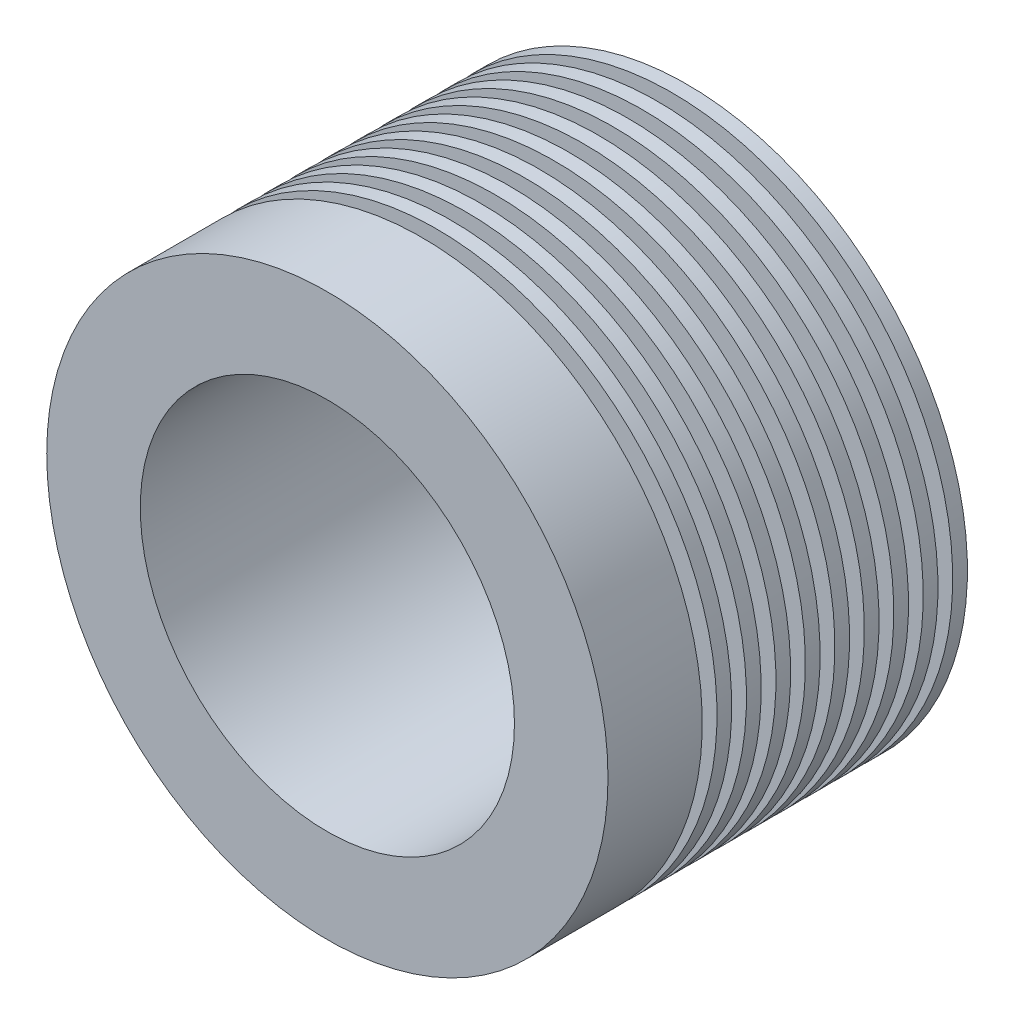
ISO-10303-21;
HEADER;
FILE_DESCRIPTION(('STEP AP214'),'2;1');
FILE_NAME('part.step','',(''),(''),'','','');
FILE_SCHEMA(('AUTOMOTIVE_DESIGN { 1 0 10303 214 1 1 1 1 }'));
ENDSEC;
DATA;
#1=APPLICATION_CONTEXT('core data for automotive mechanical design processes');
#2=APPLICATION_PROTOCOL_DEFINITION('international standard','automotive_design',2000,#1);
#3=PRODUCT_CONTEXT('',#1,'mechanical');
#4=PRODUCT('Part','Part','',(#3));
#5=PRODUCT_RELATED_PRODUCT_CATEGORY('part','',(#4));
#6=PRODUCT_DEFINITION_FORMATION('','',#4);
#7=PRODUCT_DEFINITION_CONTEXT('part definition',#1,'design');
#8=PRODUCT_DEFINITION('design','',#6,#7);
#9=PRODUCT_DEFINITION_SHAPE('','',#8);
#10=(LENGTH_UNIT() NAMED_UNIT(*) SI_UNIT(.MILLI.,.METRE.));
#11=(NAMED_UNIT(*) PLANE_ANGLE_UNIT() SI_UNIT($,.RADIAN.));
#12=(NAMED_UNIT(*) SI_UNIT($,.STERADIAN.) SOLID_ANGLE_UNIT());
#13=UNCERTAINTY_MEASURE_WITH_UNIT(LENGTH_MEASURE(1.E-05),#10,'distance_accuracy_value','');
#14=(GEOMETRIC_REPRESENTATION_CONTEXT(3) GLOBAL_UNCERTAINTY_ASSIGNED_CONTEXT((#13)) GLOBAL_UNIT_ASSIGNED_CONTEXT((#10,
#11,#12)) REPRESENTATION_CONTEXT('',''));
#15=CARTESIAN_POINT('',(0.,0.,0.));
#16=DIRECTION('',(0.,0.,1.));
#17=DIRECTION('',(1.,0.,0.));
#18=AXIS2_PLACEMENT_3D('',#15,#16,#17);
#19=CARTESIAN_POINT('',(0.,0.,50.8));
#20=DIRECTION('',(0.,0.,-1.));
#21=DIRECTION('',(-1.,0.,0.));
#22=AXIS2_PLACEMENT_3D('',#19,#20,#21);
#23=CYLINDRICAL_SURFACE('',#22,38.1);
#24=CARTESIAN_POINT('',(0.,0.,4.));
#25=DIRECTION('',(0.,0.,-1.));
#26=DIRECTION('',(-1.,0.,0.));
#27=AXIS2_PLACEMENT_3D('',#24,#25,#26);
#28=CIRCLE('',#27,38.1);
#29=CARTESIAN_POINT('',(-38.1,0.,4.));
#30=VERTEX_POINT('',#29);
#31=EDGE_CURVE('E131',#30,#30,#28,.T.);
#32=ORIENTED_EDGE('',*,*,#31,.T.);
#33=EDGE_LOOP('',(#32));
#34=FACE_BOUND('',#33,.T.);
#35=CARTESIAN_POINT('',(0.,0.,2.));
#36=DIRECTION('',(0.,0.,-1.));
#37=DIRECTION('',(-1.,0.,0.));
#38=AXIS2_PLACEMENT_3D('',#35,#36,#37);
#39=CIRCLE('',#38,38.1);
#40=CARTESIAN_POINT('',(-38.1,0.,2.));
#41=VERTEX_POINT('',#40);
#42=EDGE_CURVE('E55',#41,#41,#39,.T.);
#43=ORIENTED_EDGE('',*,*,#42,.F.);
#44=EDGE_LOOP('',(#43));
#45=FACE_BOUND('',#44,.T.);
#46=ADVANCED_FACE('F47',(#34,#45),#23,.T.);
#47=CARTESIAN_POINT('',(0.,0.,2.));
#48=DIRECTION('',(0.,0.,-1.));
#49=DIRECTION('',(-1.,0.,0.));
#50=AXIS2_PLACEMENT_3D('',#47,#48,#49);
#51=PLANE('',#50);
#52=CARTESIAN_POINT('',(0.,0.,2.));
#53=DIRECTION('',(0.,0.,-1.));
#54=DIRECTION('',(-1.,0.,0.));
#55=AXIS2_PLACEMENT_3D('',#52,#53,#54);
#56=CIRCLE('',#55,31.75);
#57=CARTESIAN_POINT('',(-31.75,0.,2.));
#58=VERTEX_POINT('',#57);
#59=EDGE_CURVE('E61',#58,#58,#56,.T.);
#60=ORIENTED_EDGE('',*,*,#59,.F.);
#61=EDGE_LOOP('',(#60));
#62=FACE_BOUND('',#61,.T.);
#63=ORIENTED_EDGE('',*,*,#42,.T.);
#64=EDGE_LOOP('',(#63));
#65=FACE_BOUND('',#64,.T.);
#66=ADVANCED_FACE('F253',(#62,#65),#51,.T.);
#67=CARTESIAN_POINT('',(0.,0.,2.));
#68=DIRECTION('',(0.,0.,-1.));
#69=DIRECTION('',(-1.,0.,0.));
#70=AXIS2_PLACEMENT_3D('',#67,#68,#69);
#71=CYLINDRICAL_SURFACE('',#70,31.75);
#72=ORIENTED_EDGE('',*,*,#59,.T.);
#73=EDGE_LOOP('',(#72));
#74=FACE_BOUND('',#73,.T.);
#75=CARTESIAN_POINT('',(0.,0.,0.));
#76=DIRECTION('',(0.,0.,-1.));
#77=DIRECTION('',(-1.,0.,0.));
#78=AXIS2_PLACEMENT_3D('',#75,#76,#77);
#79=CIRCLE('',#78,31.75);
#80=CARTESIAN_POINT('',(-31.75,0.,0.));
#81=VERTEX_POINT('',#80);
#82=EDGE_CURVE('E64',#81,#81,#79,.T.);
#83=ORIENTED_EDGE('',*,*,#82,.F.);
#84=EDGE_LOOP('',(#83));
#85=FACE_BOUND('',#84,.T.);
#86=ADVANCED_FACE('F258',(#74,#85),#71,.T.);
#87=CARTESIAN_POINT('',(0.,0.,0.));
#88=DIRECTION('',(0.,0.,1.));
#89=DIRECTION('',(1.,0.,0.));
#90=AXIS2_PLACEMENT_3D('',#87,#88,#89);
#91=PLANE('',#90);
#92=ORIENTED_EDGE('',*,*,#82,.T.);
#93=EDGE_LOOP('',(#92));
#94=FACE_BOUND('',#93,.T.);
#95=ADVANCED_FACE('F390',(#94),#91,.F.);
#96=CARTESIAN_POINT('',(0.,0.,6.));
#97=DIRECTION('',(0.,0.,-1.));
#98=DIRECTION('',(-1.,0.,0.));
#99=AXIS2_PLACEMENT_3D('',#96,#97,#98);
#100=PLANE('',#99);
#101=CARTESIAN_POINT('',(0.,0.,6.));
#102=DIRECTION('',(0.,0.,-1.));
#103=DIRECTION('',(-1.,0.,0.));
#104=AXIS2_PLACEMENT_3D('',#101,#102,#103);
#105=CIRCLE('',#104,31.75);
#106=CARTESIAN_POINT('',(-31.75,0.,6.));
#107=VERTEX_POINT('',#106);
#108=EDGE_CURVE('E72',#107,#107,#105,.T.);
#109=ORIENTED_EDGE('',*,*,#108,.F.);
#110=EDGE_LOOP('',(#109));
#111=FACE_BOUND('',#110,.T.);
#112=CARTESIAN_POINT('',(0.,0.,6.));
#113=DIRECTION('',(0.,0.,-1.));
#114=DIRECTION('',(-1.,0.,0.));
#115=AXIS2_PLACEMENT_3D('',#112,#113,#114);
#116=CIRCLE('',#115,38.1);
#117=CARTESIAN_POINT('',(-38.1,0.,6.));
#118=VERTEX_POINT('',#117);
#119=EDGE_CURVE('E50',#118,#118,#116,.T.);
#120=ORIENTED_EDGE('',*,*,#119,.T.);
#121=EDGE_LOOP('',(#120));
#122=FACE_BOUND('',#121,.T.);
#123=ADVANCED_FACE('F394',(#111,#122),#100,.T.);
#124=CARTESIAN_POINT('',(0.,0.,4.));
#125=DIRECTION('',(0.,0.,-1.));
#126=DIRECTION('',(-1.,0.,0.));
#127=AXIS2_PLACEMENT_3D('',#124,#125,#126);
#128=PLANE('',#127);
#129=CARTESIAN_POINT('',(0.,0.,4.));
#130=DIRECTION('',(0.,0.,-1.));
#131=DIRECTION('',(-1.,0.,0.));
#132=AXIS2_PLACEMENT_3D('',#129,#130,#131);
#133=CIRCLE('',#132,31.75);
#134=CARTESIAN_POINT('',(-31.75,0.,4.));
#135=VERTEX_POINT('',#134);
#136=EDGE_CURVE('E214',#135,#135,#133,.T.);
#137=ORIENTED_EDGE('',*,*,#136,.T.);
#138=EDGE_LOOP('',(#137));
#139=FACE_BOUND('',#138,.T.);
#140=ORIENTED_EDGE('',*,*,#31,.F.);
#141=EDGE_LOOP('',(#140));
#142=FACE_BOUND('',#141,.T.);
#143=ADVANCED_FACE('F273',(#139,#142),#128,.F.);
#144=CARTESIAN_POINT('',(0.,0.,6.));
#145=DIRECTION('',(0.,0.,-1.));
#146=DIRECTION('',(-1.,0.,0.));
#147=AXIS2_PLACEMENT_3D('',#144,#145,#146);
#148=CYLINDRICAL_SURFACE('',#147,31.75);
#149=ORIENTED_EDGE('',*,*,#108,.T.);
#150=EDGE_LOOP('',(#149));
#151=FACE_BOUND('',#150,.T.);
#152=ORIENTED_EDGE('',*,*,#136,.F.);
#153=EDGE_LOOP('',(#152));
#154=FACE_BOUND('',#153,.T.);
#155=ADVANCED_FACE('F263',(#151,#154),#148,.T.);
#156=CARTESIAN_POINT('',(0.,0.,8.));
#157=DIRECTION('',(0.,0.,-1.));
#158=DIRECTION('',(-1.,0.,0.));
#159=AXIS2_PLACEMENT_3D('',#156,#157,#158);
#160=CIRCLE('',#159,38.1);
#161=CARTESIAN_POINT('',(-38.1,0.,8.));
#162=VERTEX_POINT('',#161);
#163=EDGE_CURVE('E124',#162,#162,#160,.T.);
#164=ORIENTED_EDGE('',*,*,#163,.T.);
#165=EDGE_LOOP('',(#164));
#166=FACE_BOUND('',#165,.T.);
#167=ORIENTED_EDGE('',*,*,#119,.F.);
#168=EDGE_LOOP('',(#167));
#169=FACE_BOUND('',#168,.T.);
#170=ADVANCED_FACE('F254',(#166,#169),#23,.T.);
#171=CARTESIAN_POINT('',(0.,0.,10.));
#172=DIRECTION('',(0.,0.,-1.));
#173=DIRECTION('',(-1.,0.,0.));
#174=AXIS2_PLACEMENT_3D('',#171,#172,#173);
#175=PLANE('',#174);
#176=CARTESIAN_POINT('',(0.,0.,10.));
#177=DIRECTION('',(0.,0.,-1.));
#178=DIRECTION('',(-1.,0.,0.));
#179=AXIS2_PLACEMENT_3D('',#176,#177,#178);
#180=CIRCLE('',#179,31.75);
#181=CARTESIAN_POINT('',(-31.75,0.,10.));
#182=VERTEX_POINT('',#181);
#183=EDGE_CURVE('E210',#182,#182,#180,.T.);
#184=ORIENTED_EDGE('',*,*,#183,.F.);
#185=EDGE_LOOP('',(#184));
#186=FACE_BOUND('',#185,.T.);
#187=CARTESIAN_POINT('',(0.,0.,10.));
#188=DIRECTION('',(0.,0.,-1.));
#189=DIRECTION('',(-1.,0.,0.));
#190=AXIS2_PLACEMENT_3D('',#187,#188,#189);
#191=CIRCLE('',#190,38.1);
#192=CARTESIAN_POINT('',(-38.1,0.,10.));
#193=VERTEX_POINT('',#192);
#194=EDGE_CURVE('E128',#193,#193,#191,.T.);
#195=ORIENTED_EDGE('',*,*,#194,.T.);
#196=EDGE_LOOP('',(#195));
#197=FACE_BOUND('',#196,.T.);
#198=ADVANCED_FACE('F262',(#186,#197),#175,.T.);
#199=CARTESIAN_POINT('',(0.,0.,8.));
#200=DIRECTION('',(0.,0.,-1.));
#201=DIRECTION('',(-1.,0.,0.));
#202=AXIS2_PLACEMENT_3D('',#199,#200,#201);
#203=PLANE('',#202);
#204=CARTESIAN_POINT('',(0.,0.,8.));
#205=DIRECTION('',(0.,0.,-1.));
#206=DIRECTION('',(-1.,0.,0.));
#207=AXIS2_PLACEMENT_3D('',#204,#205,#206);
#208=CIRCLE('',#207,31.75);
#209=CARTESIAN_POINT('',(-31.75,0.,8.));
#210=VERTEX_POINT('',#209);
#211=EDGE_CURVE('E206',#210,#210,#208,.T.);
#212=ORIENTED_EDGE('',*,*,#211,.T.);
#213=EDGE_LOOP('',(#212));
#214=FACE_BOUND('',#213,.T.);
#215=ORIENTED_EDGE('',*,*,#163,.F.);
#216=EDGE_LOOP('',(#215));
#217=FACE_BOUND('',#216,.T.);
#218=ADVANCED_FACE('F270',(#214,#217),#203,.F.);
#219=CARTESIAN_POINT('',(0.,0.,10.));
#220=DIRECTION('',(0.,0.,-1.));
#221=DIRECTION('',(-1.,0.,0.));
#222=AXIS2_PLACEMENT_3D('',#219,#220,#221);
#223=CYLINDRICAL_SURFACE('',#222,31.75);
#224=ORIENTED_EDGE('',*,*,#183,.T.);
#225=EDGE_LOOP('',(#224));
#226=FACE_BOUND('',#225,.T.);
#227=ORIENTED_EDGE('',*,*,#211,.F.);
#228=EDGE_LOOP('',(#227));
#229=FACE_BOUND('',#228,.T.);
#230=ADVANCED_FACE('F279',(#226,#229),#223,.T.);
#231=CARTESIAN_POINT('',(0.,0.,12.));
#232=DIRECTION('',(0.,0.,-1.));
#233=DIRECTION('',(-1.,0.,0.));
#234=AXIS2_PLACEMENT_3D('',#231,#232,#233);
#235=CIRCLE('',#234,38.1);
#236=CARTESIAN_POINT('',(-38.1,0.,12.));
#237=VERTEX_POINT('',#236);
#238=EDGE_CURVE('E116',#237,#237,#235,.T.);
#239=ORIENTED_EDGE('',*,*,#238,.T.);
#240=EDGE_LOOP('',(#239));
#241=FACE_BOUND('',#240,.T.);
#242=ORIENTED_EDGE('',*,*,#194,.F.);
#243=EDGE_LOOP('',(#242));
#244=FACE_BOUND('',#243,.T.);
#245=ADVANCED_FACE('F265',(#241,#244),#23,.T.);
#246=CARTESIAN_POINT('',(0.,0.,14.));
#247=DIRECTION('',(0.,0.,-1.));
#248=DIRECTION('',(-1.,0.,0.));
#249=AXIS2_PLACEMENT_3D('',#246,#247,#248);
#250=PLANE('',#249);
#251=CARTESIAN_POINT('',(0.,0.,14.));
#252=DIRECTION('',(0.,0.,-1.));
#253=DIRECTION('',(-1.,0.,0.));
#254=AXIS2_PLACEMENT_3D('',#251,#252,#253);
#255=CIRCLE('',#254,31.75);
#256=CARTESIAN_POINT('',(-31.75,0.,14.));
#257=VERTEX_POINT('',#256);
#258=EDGE_CURVE('E202',#257,#257,#255,.T.);
#259=ORIENTED_EDGE('',*,*,#258,.F.);
#260=EDGE_LOOP('',(#259));
#261=FACE_BOUND('',#260,.T.);
#262=CARTESIAN_POINT('',(0.,0.,14.));
#263=DIRECTION('',(0.,0.,-1.));
#264=DIRECTION('',(-1.,0.,0.));
#265=AXIS2_PLACEMENT_3D('',#262,#263,#264);
#266=CIRCLE('',#265,38.1);
#267=CARTESIAN_POINT('',(-38.1,0.,14.));
#268=VERTEX_POINT('',#267);
#269=EDGE_CURVE('E120',#268,#268,#266,.T.);
#270=ORIENTED_EDGE('',*,*,#269,.T.);
#271=EDGE_LOOP('',(#270));
#272=FACE_BOUND('',#271,.T.);
#273=ADVANCED_FACE('F278',(#261,#272),#250,.T.);
#274=CARTESIAN_POINT('',(0.,0.,12.));
#275=DIRECTION('',(0.,0.,-1.));
#276=DIRECTION('',(-1.,0.,0.));
#277=AXIS2_PLACEMENT_3D('',#274,#275,#276);
#278=PLANE('',#277);
#279=CARTESIAN_POINT('',(0.,0.,12.));
#280=DIRECTION('',(0.,0.,-1.));
#281=DIRECTION('',(-1.,0.,0.));
#282=AXIS2_PLACEMENT_3D('',#279,#280,#281);
#283=CIRCLE('',#282,31.75);
#284=CARTESIAN_POINT('',(-31.75,0.,12.));
#285=VERTEX_POINT('',#284);
#286=EDGE_CURVE('E198',#285,#285,#283,.T.);
#287=ORIENTED_EDGE('',*,*,#286,.T.);
#288=EDGE_LOOP('',(#287));
#289=FACE_BOUND('',#288,.T.);
#290=ORIENTED_EDGE('',*,*,#238,.F.);
#291=EDGE_LOOP('',(#290));
#292=FACE_BOUND('',#291,.T.);
#293=ADVANCED_FACE('F286',(#289,#292),#278,.F.);
#294=CARTESIAN_POINT('',(0.,0.,14.));
#295=DIRECTION('',(0.,0.,-1.));
#296=DIRECTION('',(-1.,0.,0.));
#297=AXIS2_PLACEMENT_3D('',#294,#295,#296);
#298=CYLINDRICAL_SURFACE('',#297,31.75);
#299=ORIENTED_EDGE('',*,*,#258,.T.);
#300=EDGE_LOOP('',(#299));
#301=FACE_BOUND('',#300,.T.);
#302=ORIENTED_EDGE('',*,*,#286,.F.);
#303=EDGE_LOOP('',(#302));
#304=FACE_BOUND('',#303,.T.);
#305=ADVANCED_FACE('F294',(#301,#304),#298,.T.);
#306=CARTESIAN_POINT('',(0.,0.,16.));
#307=DIRECTION('',(0.,0.,-1.));
#308=DIRECTION('',(-1.,0.,0.));
#309=AXIS2_PLACEMENT_3D('',#306,#307,#308);
#310=CIRCLE('',#309,38.1);
#311=CARTESIAN_POINT('',(-38.1,0.,16.));
#312=VERTEX_POINT('',#311);
#313=EDGE_CURVE('E108',#312,#312,#310,.T.);
#314=ORIENTED_EDGE('',*,*,#313,.T.);
#315=EDGE_LOOP('',(#314));
#316=FACE_BOUND('',#315,.T.);
#317=ORIENTED_EDGE('',*,*,#269,.F.);
#318=EDGE_LOOP('',(#317));
#319=FACE_BOUND('',#318,.T.);
#320=ADVANCED_FACE('F281',(#316,#319),#23,.T.);
#321=CARTESIAN_POINT('',(0.,0.,18.));
#322=DIRECTION('',(0.,0.,-1.));
#323=DIRECTION('',(-1.,0.,0.));
#324=AXIS2_PLACEMENT_3D('',#321,#322,#323);
#325=PLANE('',#324);
#326=CARTESIAN_POINT('',(0.,0.,18.));
#327=DIRECTION('',(0.,0.,-1.));
#328=DIRECTION('',(-1.,0.,0.));
#329=AXIS2_PLACEMENT_3D('',#326,#327,#328);
#330=CIRCLE('',#329,31.75);
#331=CARTESIAN_POINT('',(-31.75,0.,18.));
#332=VERTEX_POINT('',#331);
#333=EDGE_CURVE('E194',#332,#332,#330,.T.);
#334=ORIENTED_EDGE('',*,*,#333,.F.);
#335=EDGE_LOOP('',(#334));
#336=FACE_BOUND('',#335,.T.);
#337=CARTESIAN_POINT('',(0.,0.,18.));
#338=DIRECTION('',(0.,0.,-1.));
#339=DIRECTION('',(-1.,0.,0.));
#340=AXIS2_PLACEMENT_3D('',#337,#338,#339);
#341=CIRCLE('',#340,38.1);
#342=CARTESIAN_POINT('',(-38.1,0.,18.));
#343=VERTEX_POINT('',#342);
#344=EDGE_CURVE('E112',#343,#343,#341,.T.);
#345=ORIENTED_EDGE('',*,*,#344,.T.);
#346=EDGE_LOOP('',(#345));
#347=FACE_BOUND('',#346,.T.);
#348=ADVANCED_FACE('F293',(#336,#347),#325,.T.);
#349=CARTESIAN_POINT('',(0.,0.,16.));
#350=DIRECTION('',(0.,0.,-1.));
#351=DIRECTION('',(-1.,0.,0.));
#352=AXIS2_PLACEMENT_3D('',#349,#350,#351);
#353=PLANE('',#352);
#354=CARTESIAN_POINT('',(0.,0.,16.));
#355=DIRECTION('',(0.,0.,-1.));
#356=DIRECTION('',(-1.,0.,0.));
#357=AXIS2_PLACEMENT_3D('',#354,#355,#356);
#358=CIRCLE('',#357,31.75);
#359=CARTESIAN_POINT('',(-31.75,0.,16.));
#360=VERTEX_POINT('',#359);
#361=EDGE_CURVE('E190',#360,#360,#358,.T.);
#362=ORIENTED_EDGE('',*,*,#361,.T.);
#363=EDGE_LOOP('',(#362));
#364=FACE_BOUND('',#363,.T.);
#365=ORIENTED_EDGE('',*,*,#313,.F.);
#366=EDGE_LOOP('',(#365));
#367=FACE_BOUND('',#366,.T.);
#368=ADVANCED_FACE('F301',(#364,#367),#353,.F.);
#369=CARTESIAN_POINT('',(0.,0.,18.));
#370=DIRECTION('',(0.,0.,-1.));
#371=DIRECTION('',(-1.,0.,0.));
#372=AXIS2_PLACEMENT_3D('',#369,#370,#371);
#373=CYLINDRICAL_SURFACE('',#372,31.75);
#374=ORIENTED_EDGE('',*,*,#333,.T.);
#375=EDGE_LOOP('',(#374));
#376=FACE_BOUND('',#375,.T.);
#377=ORIENTED_EDGE('',*,*,#361,.F.);
#378=EDGE_LOOP('',(#377));
#379=FACE_BOUND('',#378,.T.);
#380=ADVANCED_FACE('F309',(#376,#379),#373,.T.);
#381=CARTESIAN_POINT('',(0.,0.,20.));
#382=DIRECTION('',(0.,0.,-1.));
#383=DIRECTION('',(-1.,0.,0.));
#384=AXIS2_PLACEMENT_3D('',#381,#382,#383);
#385=CIRCLE('',#384,38.1);
#386=CARTESIAN_POINT('',(-38.1,0.,20.));
#387=VERTEX_POINT('',#386);
#388=EDGE_CURVE('E100',#387,#387,#385,.T.);
#389=ORIENTED_EDGE('',*,*,#388,.T.);
#390=EDGE_LOOP('',(#389));
#391=FACE_BOUND('',#390,.T.);
#392=ORIENTED_EDGE('',*,*,#344,.F.);
#393=EDGE_LOOP('',(#392));
#394=FACE_BOUND('',#393,.T.);
#395=ADVANCED_FACE('F296',(#391,#394),#23,.T.);
#396=CARTESIAN_POINT('',(0.,0.,22.));
#397=DIRECTION('',(0.,0.,-1.));
#398=DIRECTION('',(-1.,0.,0.));
#399=AXIS2_PLACEMENT_3D('',#396,#397,#398);
#400=PLANE('',#399);
#401=CARTESIAN_POINT('',(0.,0.,22.));
#402=DIRECTION('',(0.,0.,-1.));
#403=DIRECTION('',(-1.,0.,0.));
#404=AXIS2_PLACEMENT_3D('',#401,#402,#403);
#405=CIRCLE('',#404,31.75);
#406=CARTESIAN_POINT('',(-31.75,0.,22.));
#407=VERTEX_POINT('',#406);
#408=EDGE_CURVE('E186',#407,#407,#405,.T.);
#409=ORIENTED_EDGE('',*,*,#408,.F.);
#410=EDGE_LOOP('',(#409));
#411=FACE_BOUND('',#410,.T.);
#412=CARTESIAN_POINT('',(0.,0.,22.));
#413=DIRECTION('',(0.,0.,-1.));
#414=DIRECTION('',(-1.,0.,0.));
#415=AXIS2_PLACEMENT_3D('',#412,#413,#414);
#416=CIRCLE('',#415,38.1);
#417=CARTESIAN_POINT('',(-38.1,0.,22.));
#418=VERTEX_POINT('',#417);
#419=EDGE_CURVE('E104',#418,#418,#416,.T.);
#420=ORIENTED_EDGE('',*,*,#419,.T.);
#421=EDGE_LOOP('',(#420));
#422=FACE_BOUND('',#421,.T.);
#423=ADVANCED_FACE('F308',(#411,#422),#400,.T.);
#424=CARTESIAN_POINT('',(0.,0.,20.));
#425=DIRECTION('',(0.,0.,-1.));
#426=DIRECTION('',(-1.,0.,0.));
#427=AXIS2_PLACEMENT_3D('',#424,#425,#426);
#428=PLANE('',#427);
#429=CARTESIAN_POINT('',(0.,0.,20.));
#430=DIRECTION('',(0.,0.,-1.));
#431=DIRECTION('',(-1.,0.,0.));
#432=AXIS2_PLACEMENT_3D('',#429,#430,#431);
#433=CIRCLE('',#432,31.75);
#434=CARTESIAN_POINT('',(-31.75,0.,20.));
#435=VERTEX_POINT('',#434);
#436=EDGE_CURVE('E182',#435,#435,#433,.T.);
#437=ORIENTED_EDGE('',*,*,#436,.T.);
#438=EDGE_LOOP('',(#437));
#439=FACE_BOUND('',#438,.T.);
#440=ORIENTED_EDGE('',*,*,#388,.F.);
#441=EDGE_LOOP('',(#440));
#442=FACE_BOUND('',#441,.T.);
#443=ADVANCED_FACE('F316',(#439,#442),#428,.F.);
#444=CARTESIAN_POINT('',(0.,0.,22.));
#445=DIRECTION('',(0.,0.,-1.));
#446=DIRECTION('',(-1.,0.,0.));
#447=AXIS2_PLACEMENT_3D('',#444,#445,#446);
#448=CYLINDRICAL_SURFACE('',#447,31.75);
#449=ORIENTED_EDGE('',*,*,#408,.T.);
#450=EDGE_LOOP('',(#449));
#451=FACE_BOUND('',#450,.T.);
#452=ORIENTED_EDGE('',*,*,#436,.F.);
#453=EDGE_LOOP('',(#452));
#454=FACE_BOUND('',#453,.T.);
#455=ADVANCED_FACE('F324',(#451,#454),#448,.T.);
#456=CARTESIAN_POINT('',(0.,0.,24.));
#457=DIRECTION('',(0.,0.,-1.));
#458=DIRECTION('',(-1.,0.,0.));
#459=AXIS2_PLACEMENT_3D('',#456,#457,#458);
#460=CIRCLE('',#459,38.1);
#461=CARTESIAN_POINT('',(-38.1,0.,24.));
#462=VERTEX_POINT('',#461);
#463=EDGE_CURVE('E92',#462,#462,#460,.T.);
#464=ORIENTED_EDGE('',*,*,#463,.T.);
#465=EDGE_LOOP('',(#464));
#466=FACE_BOUND('',#465,.T.);
#467=ORIENTED_EDGE('',*,*,#419,.F.);
#468=EDGE_LOOP('',(#467));
#469=FACE_BOUND('',#468,.T.);
#470=ADVANCED_FACE('F311',(#466,#469),#23,.T.);
#471=CARTESIAN_POINT('',(0.,0.,26.));
#472=DIRECTION('',(0.,0.,-1.));
#473=DIRECTION('',(-1.,0.,0.));
#474=AXIS2_PLACEMENT_3D('',#471,#472,#473);
#475=PLANE('',#474);
#476=CARTESIAN_POINT('',(0.,0.,26.));
#477=DIRECTION('',(0.,0.,-1.));
#478=DIRECTION('',(-1.,0.,0.));
#479=AXIS2_PLACEMENT_3D('',#476,#477,#478);
#480=CIRCLE('',#479,31.75);
#481=CARTESIAN_POINT('',(-31.75,0.,26.));
#482=VERTEX_POINT('',#481);
#483=EDGE_CURVE('E178',#482,#482,#480,.T.);
#484=ORIENTED_EDGE('',*,*,#483,.F.);
#485=EDGE_LOOP('',(#484));
#486=FACE_BOUND('',#485,.T.);
#487=CARTESIAN_POINT('',(0.,0.,26.));
#488=DIRECTION('',(0.,0.,-1.));
#489=DIRECTION('',(-1.,0.,0.));
#490=AXIS2_PLACEMENT_3D('',#487,#488,#489);
#491=CIRCLE('',#490,38.1);
#492=CARTESIAN_POINT('',(-38.1,0.,26.));
#493=VERTEX_POINT('',#492);
#494=EDGE_CURVE('E96',#493,#493,#491,.T.);
#495=ORIENTED_EDGE('',*,*,#494,.T.);
#496=EDGE_LOOP('',(#495));
#497=FACE_BOUND('',#496,.T.);
#498=ADVANCED_FACE('F323',(#486,#497),#475,.T.);
#499=CARTESIAN_POINT('',(0.,0.,24.));
#500=DIRECTION('',(0.,0.,-1.));
#501=DIRECTION('',(-1.,0.,0.));
#502=AXIS2_PLACEMENT_3D('',#499,#500,#501);
#503=PLANE('',#502);
#504=CARTESIAN_POINT('',(0.,0.,24.));
#505=DIRECTION('',(0.,0.,-1.));
#506=DIRECTION('',(-1.,0.,0.));
#507=AXIS2_PLACEMENT_3D('',#504,#505,#506);
#508=CIRCLE('',#507,31.75);
#509=CARTESIAN_POINT('',(-31.75,0.,24.));
#510=VERTEX_POINT('',#509);
#511=EDGE_CURVE('E174',#510,#510,#508,.T.);
#512=ORIENTED_EDGE('',*,*,#511,.T.);
#513=EDGE_LOOP('',(#512));
#514=FACE_BOUND('',#513,.T.);
#515=ORIENTED_EDGE('',*,*,#463,.F.);
#516=EDGE_LOOP('',(#515));
#517=FACE_BOUND('',#516,.T.);
#518=ADVANCED_FACE('F331',(#514,#517),#503,.F.);
#519=CARTESIAN_POINT('',(0.,0.,26.));
#520=DIRECTION('',(0.,0.,-1.));
#521=DIRECTION('',(-1.,0.,0.));
#522=AXIS2_PLACEMENT_3D('',#519,#520,#521);
#523=CYLINDRICAL_SURFACE('',#522,31.75);
#524=ORIENTED_EDGE('',*,*,#483,.T.);
#525=EDGE_LOOP('',(#524));
#526=FACE_BOUND('',#525,.T.);
#527=ORIENTED_EDGE('',*,*,#511,.F.);
#528=EDGE_LOOP('',(#527));
#529=FACE_BOUND('',#528,.T.);
#530=ADVANCED_FACE('F339',(#526,#529),#523,.T.);
#531=CARTESIAN_POINT('',(0.,0.,28.));
#532=DIRECTION('',(0.,0.,-1.));
#533=DIRECTION('',(-1.,0.,0.));
#534=AXIS2_PLACEMENT_3D('',#531,#532,#533);
#535=CIRCLE('',#534,38.1);
#536=CARTESIAN_POINT('',(-38.1,0.,28.));
#537=VERTEX_POINT('',#536);
#538=EDGE_CURVE('E84',#537,#537,#535,.T.);
#539=ORIENTED_EDGE('',*,*,#538,.T.);
#540=EDGE_LOOP('',(#539));
#541=FACE_BOUND('',#540,.T.);
#542=ORIENTED_EDGE('',*,*,#494,.F.);
#543=EDGE_LOOP('',(#542));
#544=FACE_BOUND('',#543,.T.);
#545=ADVANCED_FACE('F326',(#541,#544),#23,.T.);
#546=CARTESIAN_POINT('',(0.,0.,30.));
#547=DIRECTION('',(0.,0.,-1.));
#548=DIRECTION('',(-1.,0.,0.));
#549=AXIS2_PLACEMENT_3D('',#546,#547,#548);
#550=PLANE('',#549);
#551=CARTESIAN_POINT('',(0.,0.,30.));
#552=DIRECTION('',(0.,0.,-1.));
#553=DIRECTION('',(-1.,0.,0.));
#554=AXIS2_PLACEMENT_3D('',#551,#552,#553);
#555=CIRCLE('',#554,31.75);
#556=CARTESIAN_POINT('',(-31.75,0.,30.));
#557=VERTEX_POINT('',#556);
#558=EDGE_CURVE('E170',#557,#557,#555,.T.);
#559=ORIENTED_EDGE('',*,*,#558,.F.);
#560=EDGE_LOOP('',(#559));
#561=FACE_BOUND('',#560,.T.);
#562=CARTESIAN_POINT('',(0.,0.,30.));
#563=DIRECTION('',(0.,0.,-1.));
#564=DIRECTION('',(-1.,0.,0.));
#565=AXIS2_PLACEMENT_3D('',#562,#563,#564);
#566=CIRCLE('',#565,38.1);
#567=CARTESIAN_POINT('',(-38.1,0.,30.));
#568=VERTEX_POINT('',#567);
#569=EDGE_CURVE('E88',#568,#568,#566,.T.);
#570=ORIENTED_EDGE('',*,*,#569,.T.);
#571=EDGE_LOOP('',(#570));
#572=FACE_BOUND('',#571,.T.);
#573=ADVANCED_FACE('F338',(#561,#572),#550,.T.);
#574=CARTESIAN_POINT('',(0.,0.,28.));
#575=DIRECTION('',(0.,0.,-1.));
#576=DIRECTION('',(-1.,0.,0.));
#577=AXIS2_PLACEMENT_3D('',#574,#575,#576);
#578=PLANE('',#577);
#579=CARTESIAN_POINT('',(0.,0.,28.));
#580=DIRECTION('',(0.,0.,-1.));
#581=DIRECTION('',(-1.,0.,0.));
#582=AXIS2_PLACEMENT_3D('',#579,#580,#581);
#583=CIRCLE('',#582,31.75);
#584=CARTESIAN_POINT('',(-31.75,0.,28.));
#585=VERTEX_POINT('',#584);
#586=EDGE_CURVE('E166',#585,#585,#583,.T.);
#587=ORIENTED_EDGE('',*,*,#586,.T.);
#588=EDGE_LOOP('',(#587));
#589=FACE_BOUND('',#588,.T.);
#590=ORIENTED_EDGE('',*,*,#538,.F.);
#591=EDGE_LOOP('',(#590));
#592=FACE_BOUND('',#591,.T.);
#593=ADVANCED_FACE('F346',(#589,#592),#578,.F.);
#594=CARTESIAN_POINT('',(0.,0.,30.));
#595=DIRECTION('',(0.,0.,-1.));
#596=DIRECTION('',(-1.,0.,0.));
#597=AXIS2_PLACEMENT_3D('',#594,#595,#596);
#598=CYLINDRICAL_SURFACE('',#597,31.75);
#599=ORIENTED_EDGE('',*,*,#558,.T.);
#600=EDGE_LOOP('',(#599));
#601=FACE_BOUND('',#600,.T.);
#602=ORIENTED_EDGE('',*,*,#586,.F.);
#603=EDGE_LOOP('',(#602));
#604=FACE_BOUND('',#603,.T.);
#605=ADVANCED_FACE('F354',(#601,#604),#598,.T.);
#606=CARTESIAN_POINT('',(0.,0.,32.));
#607=DIRECTION('',(0.,0.,-1.));
#608=DIRECTION('',(-1.,0.,0.));
#609=AXIS2_PLACEMENT_3D('',#606,#607,#608);
#610=CIRCLE('',#609,38.1);
#611=CARTESIAN_POINT('',(-38.1,0.,32.));
#612=VERTEX_POINT('',#611);
#613=EDGE_CURVE('E76',#612,#612,#610,.T.);
#614=ORIENTED_EDGE('',*,*,#613,.T.);
#615=EDGE_LOOP('',(#614));
#616=FACE_BOUND('',#615,.T.);
#617=ORIENTED_EDGE('',*,*,#569,.F.);
#618=EDGE_LOOP('',(#617));
#619=FACE_BOUND('',#618,.T.);
#620=ADVANCED_FACE('F341',(#616,#619),#23,.T.);
#621=CARTESIAN_POINT('',(0.,0.,34.));
#622=DIRECTION('',(0.,0.,-1.));
#623=DIRECTION('',(-1.,0.,0.));
#624=AXIS2_PLACEMENT_3D('',#621,#622,#623);
#625=PLANE('',#624);
#626=CARTESIAN_POINT('',(0.,0.,34.));
#627=DIRECTION('',(0.,0.,-1.));
#628=DIRECTION('',(-1.,0.,0.));
#629=AXIS2_PLACEMENT_3D('',#626,#627,#628);
#630=CIRCLE('',#629,31.75);
#631=CARTESIAN_POINT('',(-31.75,0.,34.));
#632=VERTEX_POINT('',#631);
#633=EDGE_CURVE('E162',#632,#632,#630,.T.);
#634=ORIENTED_EDGE('',*,*,#633,.F.);
#635=EDGE_LOOP('',(#634));
#636=FACE_BOUND('',#635,.T.);
#637=CARTESIAN_POINT('',(0.,0.,34.));
#638=DIRECTION('',(0.,0.,-1.));
#639=DIRECTION('',(-1.,0.,0.));
#640=AXIS2_PLACEMENT_3D('',#637,#638,#639);
#641=CIRCLE('',#640,38.1);
#642=CARTESIAN_POINT('',(-38.1,0.,34.));
#643=VERTEX_POINT('',#642);
#644=EDGE_CURVE('E80',#643,#643,#641,.T.);
#645=ORIENTED_EDGE('',*,*,#644,.T.);
#646=EDGE_LOOP('',(#645));
#647=FACE_BOUND('',#646,.T.);
#648=ADVANCED_FACE('F353',(#636,#647),#625,.T.);
#649=CARTESIAN_POINT('',(0.,0.,32.));
#650=DIRECTION('',(0.,0.,-1.));
#651=DIRECTION('',(-1.,0.,0.));
#652=AXIS2_PLACEMENT_3D('',#649,#650,#651);
#653=PLANE('',#652);
#654=CARTESIAN_POINT('',(0.,0.,32.));
#655=DIRECTION('',(0.,0.,-1.));
#656=DIRECTION('',(-1.,0.,0.));
#657=AXIS2_PLACEMENT_3D('',#654,#655,#656);
#658=CIRCLE('',#657,31.75);
#659=CARTESIAN_POINT('',(-31.75,0.,32.));
#660=VERTEX_POINT('',#659);
#661=EDGE_CURVE('E158',#660,#660,#658,.T.);
#662=ORIENTED_EDGE('',*,*,#661,.T.);
#663=EDGE_LOOP('',(#662));
#664=FACE_BOUND('',#663,.T.);
#665=ORIENTED_EDGE('',*,*,#613,.F.);
#666=EDGE_LOOP('',(#665));
#667=FACE_BOUND('',#666,.T.);
#668=ADVANCED_FACE('F360',(#664,#667),#653,.F.);
#669=CARTESIAN_POINT('',(0.,0.,34.));
#670=DIRECTION('',(0.,0.,-1.));
#671=DIRECTION('',(-1.,0.,0.));
#672=AXIS2_PLACEMENT_3D('',#669,#670,#671);
#673=CYLINDRICAL_SURFACE('',#672,31.75);
#674=ORIENTED_EDGE('',*,*,#633,.T.);
#675=EDGE_LOOP('',(#674));
#676=FACE_BOUND('',#675,.T.);
#677=ORIENTED_EDGE('',*,*,#661,.F.);
#678=EDGE_LOOP('',(#677));
#679=FACE_BOUND('',#678,.T.);
#680=ADVANCED_FACE('F368',(#676,#679),#673,.T.);
#681=CARTESIAN_POINT('',(0.,0.,36.));
#682=DIRECTION('',(0.,0.,-1.));
#683=DIRECTION('',(-1.,0.,0.));
#684=AXIS2_PLACEMENT_3D('',#681,#682,#683);
#685=CIRCLE('',#684,38.1);
#686=CARTESIAN_POINT('',(-38.1,0.,36.));
#687=VERTEX_POINT('',#686);
#688=EDGE_CURVE('E67',#687,#687,#685,.T.);
#689=ORIENTED_EDGE('',*,*,#688,.T.);
#690=EDGE_LOOP('',(#689));
#691=FACE_BOUND('',#690,.T.);
#692=ORIENTED_EDGE('',*,*,#644,.F.);
#693=EDGE_LOOP('',(#692));
#694=FACE_BOUND('',#693,.T.);
#695=ADVANCED_FACE('F247',(#691,#694),#23,.T.);
#696=CARTESIAN_POINT('',(0.,0.,38.));
#697=DIRECTION('',(0.,0.,-1.));
#698=DIRECTION('',(-1.,0.,0.));
#699=AXIS2_PLACEMENT_3D('',#696,#697,#698);
#700=PLANE('',#699);
#701=CARTESIAN_POINT('',(0.,0.,38.));
#702=DIRECTION('',(0.,0.,-1.));
#703=DIRECTION('',(-1.,0.,0.));
#704=AXIS2_PLACEMENT_3D('',#701,#702,#703);
#705=CIRCLE('',#704,31.75);
#706=CARTESIAN_POINT('',(-31.75,0.,38.));
#707=VERTEX_POINT('',#706);
#708=EDGE_CURVE('E153',#707,#707,#705,.T.);
#709=ORIENTED_EDGE('',*,*,#708,.F.);
#710=EDGE_LOOP('',(#709));
#711=FACE_BOUND('',#710,.T.);
#712=CARTESIAN_POINT('',(0.,0.,38.));
#713=DIRECTION('',(0.,0.,-1.));
#714=DIRECTION('',(-1.,0.,0.));
#715=AXIS2_PLACEMENT_3D('',#712,#713,#714);
#716=CIRCLE('',#715,38.1);
#717=CARTESIAN_POINT('',(-38.1,0.,38.));
#718=VERTEX_POINT('',#717);
#719=EDGE_CURVE('E71',#718,#718,#716,.T.);
#720=ORIENTED_EDGE('',*,*,#719,.T.);
#721=EDGE_LOOP('',(#720));
#722=FACE_BOUND('',#721,.T.);
#723=ADVANCED_FACE('F367',(#711,#722),#700,.T.);
#724=CARTESIAN_POINT('',(0.,0.,36.));
#725=DIRECTION('',(0.,0.,-1.));
#726=DIRECTION('',(-1.,0.,0.));
#727=AXIS2_PLACEMENT_3D('',#724,#725,#726);
#728=PLANE('',#727);
#729=CARTESIAN_POINT('',(0.,0.,36.));
#730=DIRECTION('',(0.,0.,-1.));
#731=DIRECTION('',(-1.,0.,0.));
#732=AXIS2_PLACEMENT_3D('',#729,#730,#731);
#733=CIRCLE('',#732,31.75);
#734=CARTESIAN_POINT('',(-31.75,0.,36.));
#735=VERTEX_POINT('',#734);
#736=EDGE_CURVE('E149',#735,#735,#733,.T.);
#737=ORIENTED_EDGE('',*,*,#736,.T.);
#738=EDGE_LOOP('',(#737));
#739=FACE_BOUND('',#738,.T.);
#740=ORIENTED_EDGE('',*,*,#688,.F.);
#741=EDGE_LOOP('',(#740));
#742=FACE_BOUND('',#741,.T.);
#743=ADVANCED_FACE('F248',(#739,#742),#728,.F.);
#744=CARTESIAN_POINT('',(0.,0.,38.));
#745=DIRECTION('',(0.,0.,-1.));
#746=DIRECTION('',(-1.,0.,0.));
#747=AXIS2_PLACEMENT_3D('',#744,#745,#746);
#748=CYLINDRICAL_SURFACE('',#747,31.75);
#749=ORIENTED_EDGE('',*,*,#708,.T.);
#750=EDGE_LOOP('',(#749));
#751=FACE_BOUND('',#750,.T.);
#752=ORIENTED_EDGE('',*,*,#736,.F.);
#753=EDGE_LOOP('',(#752));
#754=FACE_BOUND('',#753,.T.);
#755=ADVANCED_FACE('F240',(#751,#754),#748,.T.);
#756=CARTESIAN_POINT('',(0.,0.,50.8));
#757=DIRECTION('',(0.,0.,1.));
#758=DIRECTION('',(1.,0.,0.));
#759=AXIS2_PLACEMENT_3D('',#756,#757,#758);
#760=PLANE('',#759);
#761=CARTESIAN_POINT('',(0.,0.,50.8));
#762=DIRECTION('',(0.,0.,1.));
#763=DIRECTION('',(1.,0.,0.));
#764=AXIS2_PLACEMENT_3D('',#761,#762,#763);
#765=CIRCLE('',#764,25.4);
#766=CARTESIAN_POINT('',(25.4,0.,50.8));
#767=VERTEX_POINT('',#766);
#768=EDGE_CURVE('E221',#767,#767,#765,.T.);
#769=ORIENTED_EDGE('',*,*,#768,.F.);
#770=EDGE_LOOP('',(#769));
#771=FACE_BOUND('',#770,.T.);
#772=CARTESIAN_POINT('',(0.,0.,50.8));
#773=DIRECTION('',(0.,0.,1.));
#774=DIRECTION('',(1.,0.,0.));
#775=AXIS2_PLACEMENT_3D('',#772,#773,#774);
#776=CIRCLE('',#775,38.1);
#777=CARTESIAN_POINT('',(38.1,0.,50.8));
#778=VERTEX_POINT('',#777);
#779=EDGE_CURVE('E11',#778,#778,#776,.T.);
#780=ORIENTED_EDGE('',*,*,#779,.T.);
#781=EDGE_LOOP('',(#780));
#782=FACE_BOUND('',#781,.T.);
#783=ADVANCED_FACE('F238',(#771,#782),#760,.T.);
#784=ORIENTED_EDGE('',*,*,#779,.F.);
#785=EDGE_LOOP('',(#784));
#786=FACE_BOUND('',#785,.T.);
#787=ORIENTED_EDGE('',*,*,#719,.F.);
#788=EDGE_LOOP('',(#787));
#789=FACE_BOUND('',#788,.T.);
#790=ADVANCED_FACE('F234',(#786,#789),#23,.T.);
#791=CARTESIAN_POINT('',(0.,0.,12.7));
#792=DIRECTION('',(0.,0.,1.));
#793=DIRECTION('',(1.,0.,0.));
#794=AXIS2_PLACEMENT_3D('',#791,#792,#793);
#795=CYLINDRICAL_SURFACE('',#794,25.4);
#796=CARTESIAN_POINT('',(0.,0.,12.7));
#797=DIRECTION('',(0.,0.,1.));
#798=DIRECTION('',(1.,0.,0.));
#799=AXIS2_PLACEMENT_3D('',#796,#797,#798);
#800=CIRCLE('',#799,25.4);
#801=CARTESIAN_POINT('',(25.4,0.,12.7));
#802=VERTEX_POINT('',#801);
#803=EDGE_CURVE('E154',#802,#802,#800,.T.);
#804=CARTESIAN_POINT('',(25.4,0.,12.7));
#805=CARTESIAN_POINT('',(25.4,0.,13.096875));
#806=CARTESIAN_POINT('',(25.4,0.,13.49375));
#807=CARTESIAN_POINT('',(25.4,0.,14.2875));
#808=CARTESIAN_POINT('',(25.4,0.,14.684375));
#809=CARTESIAN_POINT('',(25.4,0.,15.478125));
#810=CARTESIAN_POINT('',(25.4,0.,15.875));
#811=CARTESIAN_POINT('',(25.4,0.,16.66875));
#812=CARTESIAN_POINT('',(25.4,0.,17.065625));
#813=CARTESIAN_POINT('',(25.4,0.,17.859375));
#814=CARTESIAN_POINT('',(25.4,0.,18.25625));
#815=CARTESIAN_POINT('',(25.4,0.,19.05));
#816=CARTESIAN_POINT('',(25.4,0.,19.446875));
#817=CARTESIAN_POINT('',(25.4,0.,20.240625));
#818=CARTESIAN_POINT('',(25.4,0.,20.6375));
#819=CARTESIAN_POINT('',(25.4,0.,21.43125));
#820=CARTESIAN_POINT('',(25.4,0.,21.828125));
#821=CARTESIAN_POINT('',(25.4,0.,22.621875));
#822=CARTESIAN_POINT('',(25.4,0.,23.01875));
#823=CARTESIAN_POINT('',(25.4,0.,23.8125));
#824=CARTESIAN_POINT('',(25.4,0.,24.209375));
#825=CARTESIAN_POINT('',(25.4,0.,25.003125));
#826=CARTESIAN_POINT('',(25.4,0.,25.4));
#827=CARTESIAN_POINT('',(25.4,0.,26.19375));
#828=CARTESIAN_POINT('',(25.4,0.,26.590625));
#829=CARTESIAN_POINT('',(25.4,0.,27.384375));
#830=CARTESIAN_POINT('',(25.4,0.,27.78125));
#831=CARTESIAN_POINT('',(25.4,0.,28.575));
#832=CARTESIAN_POINT('',(25.4,0.,28.971875));
#833=CARTESIAN_POINT('',(25.4,0.,29.765625));
#834=CARTESIAN_POINT('',(25.4,0.,30.1625));
#835=CARTESIAN_POINT('',(25.4,0.,30.95625));
#836=CARTESIAN_POINT('',(25.4,0.,31.353125));
#837=CARTESIAN_POINT('',(25.4,0.,32.146875));
#838=CARTESIAN_POINT('',(25.4,0.,32.54375));
#839=CARTESIAN_POINT('',(25.4,0.,33.3375));
#840=CARTESIAN_POINT('',(25.4,0.,33.734375));
#841=CARTESIAN_POINT('',(25.4,0.,34.528125));
#842=CARTESIAN_POINT('',(25.4,0.,34.925));
#843=CARTESIAN_POINT('',(25.4,0.,35.71875));
#844=CARTESIAN_POINT('',(25.4,0.,36.115625));
#845=CARTESIAN_POINT('',(25.4,0.,36.909375));
#846=CARTESIAN_POINT('',(25.4,0.,37.30625));
#847=CARTESIAN_POINT('',(25.4,0.,38.1));
#848=CARTESIAN_POINT('',(25.4,0.,38.496875));
#849=CARTESIAN_POINT('',(25.4,0.,39.290625));
#850=CARTESIAN_POINT('',(25.4,0.,39.6875));
#851=CARTESIAN_POINT('',(25.4,0.,40.48125));
#852=CARTESIAN_POINT('',(25.4,0.,40.878125));
#853=CARTESIAN_POINT('',(25.4,0.,41.671875));
#854=CARTESIAN_POINT('',(25.4,0.,42.06875));
#855=CARTESIAN_POINT('',(25.4,0.,42.8625));
#856=CARTESIAN_POINT('',(25.4,0.,43.259375));
#857=CARTESIAN_POINT('',(25.4,0.,44.053125));
#858=CARTESIAN_POINT('',(25.4,0.,44.45));
#859=CARTESIAN_POINT('',(25.4,0.,45.24375));
#860=CARTESIAN_POINT('',(25.4,0.,45.640625));
#861=CARTESIAN_POINT('',(25.4,0.,46.434375));
#862=CARTESIAN_POINT('',(25.4,0.,46.83125));
#863=CARTESIAN_POINT('',(25.4,0.,47.625));
#864=CARTESIAN_POINT('',(25.4,0.,48.021875));
#865=CARTESIAN_POINT('',(25.4,0.,48.815625));
#866=CARTESIAN_POINT('',(25.4,0.,49.2125));
#867=CARTESIAN_POINT('',(25.4,0.,50.00625));
#868=CARTESIAN_POINT('',(25.4,0.,50.403125));
#869=CARTESIAN_POINT('',(25.4,0.,50.8));
#870=B_SPLINE_CURVE_WITH_KNOTS('',3,(#804,#805,#806,#807,#808,#809,#810,#811,#812,#813,#814,
#815,#816,#817,#818,#819,#820,#821,#822,#823,#824,#825,#826,#827,#828,#829,#830,#831,#832,#833,
#834,#835,#836,#837,#838,#839,#840,#841,#842,#843,#844,#845,#846,#847,#848,#849,#850,#851,#852,
#853,#854,#855,#856,#857,#858,#859,#860,#861,#862,#863,#864,#865,#866,#867,#868,#869),
.UNSPECIFIED.,.F.,.F.,(4,2,2,2,2,2,2,2,2,2,2,2,2,2,2,2,2,2,2,2,2,2,2,2,2,2,2,2,2,2,2,2,4),(0.,
1.190625,2.38125,3.571875,4.7625,5.953125,7.14375,8.334375,9.525,10.715625,11.90625,13.096875,
14.2875,15.478125,16.66875,17.859375,19.05,20.240625,21.43125,22.621875,23.8125,25.003125,
26.19375,27.384375,28.575,29.765625,30.95625,32.146875,33.3375,34.528125,35.71875,36.909375,
38.1),.UNSPECIFIED.);
#871=EDGE_CURVE('BSEAM231',#802,#767,#870,.T.);
#872=ORIENTED_EDGE('',*,*,#803,.F.);
#873=ORIENTED_EDGE('',*,*,#768,.T.);
#874=ORIENTED_EDGE('',*,*,#871,.T.);
#875=ORIENTED_EDGE('',*,*,#871,.F.);
#876=EDGE_LOOP('',(#872,#874,#873,#875));
#877=FACE_BOUND('',#876,.T.);
#878=ADVANCED_FACE('F231',(#877),#795,.F.);
#879=CARTESIAN_POINT('',(0.,0.,12.7));
#880=DIRECTION('',(0.,0.,1.));
#881=DIRECTION('',(1.,0.,0.));
#882=AXIS2_PLACEMENT_3D('',#879,#880,#881);
#883=PLANE('',#882);
#884=ORIENTED_EDGE('',*,*,#803,.T.);
#885=EDGE_LOOP('',(#884));
#886=FACE_BOUND('',#885,.T.);
#887=ADVANCED_FACE('F229',(#886),#883,.T.);
#888=CLOSED_SHELL('',(#46,#66,#86,#95,#123,#143,#155,#170,#198,#218,#230,#245,#273,#293,#305,
#320,#348,#368,#380,#395,#423,#443,#455,#470,#498,#518,#530,#545,#573,#593,#605,#620,#648,#668,
#680,#695,#723,#743,#755,#783,#790,#878,#887));
#889=MANIFOLD_SOLID_BREP('B2',#888);
#890=ADVANCED_BREP_SHAPE_REPRESENTATION('',(#18,#889),#14);
#891=SHAPE_DEFINITION_REPRESENTATION(#9,#890);
ENDSEC;
END-ISO-10303-21;
